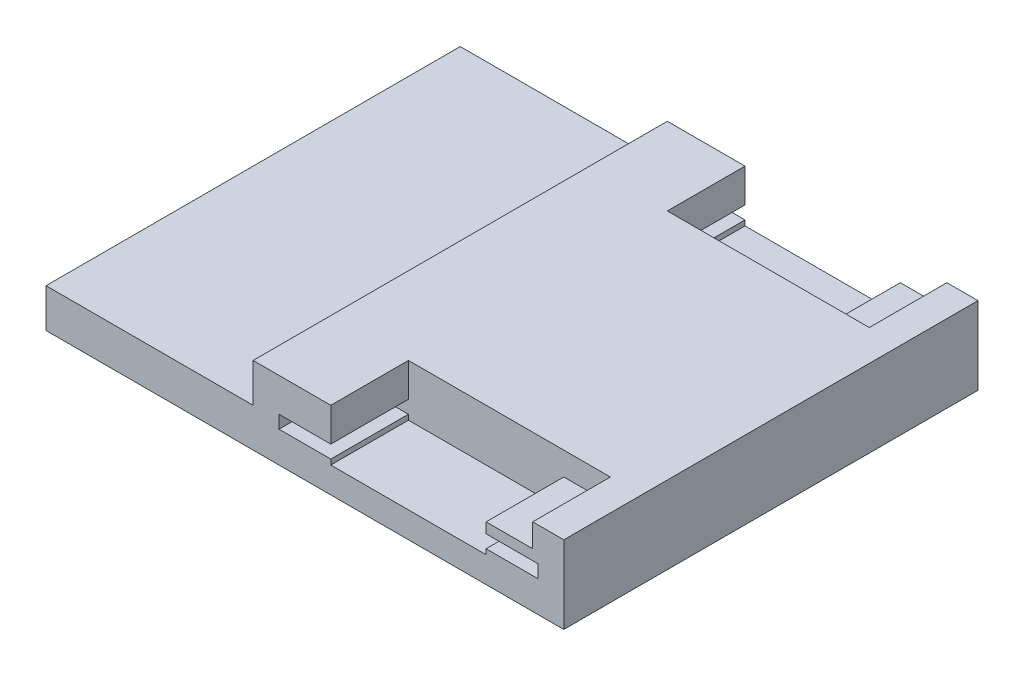
ISO-10303-21;
HEADER;
FILE_DESCRIPTION(('STEP AP214'),'2;1');
FILE_NAME('part.step','',(''),(''),'','','');
FILE_SCHEMA(('AUTOMOTIVE_DESIGN { 1 0 10303 214 1 1 1 1 }'));
ENDSEC;
DATA;
#1=APPLICATION_CONTEXT('core data for automotive mechanical design processes');
#2=APPLICATION_PROTOCOL_DEFINITION('international standard','automotive_design',2000,#1);
#3=PRODUCT_CONTEXT('',#1,'mechanical');
#4=PRODUCT('Part','Part','',(#3));
#5=PRODUCT_RELATED_PRODUCT_CATEGORY('part','',(#4));
#6=PRODUCT_DEFINITION_FORMATION('','',#4);
#7=PRODUCT_DEFINITION_CONTEXT('part definition',#1,'design');
#8=PRODUCT_DEFINITION('design','',#6,#7);
#9=PRODUCT_DEFINITION_SHAPE('','',#8);
#10=(LENGTH_UNIT() NAMED_UNIT(*) SI_UNIT(.MILLI.,.METRE.));
#11=(NAMED_UNIT(*) PLANE_ANGLE_UNIT() SI_UNIT($,.RADIAN.));
#12=(NAMED_UNIT(*) SI_UNIT($,.STERADIAN.) SOLID_ANGLE_UNIT());
#13=UNCERTAINTY_MEASURE_WITH_UNIT(LENGTH_MEASURE(1.E-05),#10,'distance_accuracy_value','');
#14=(GEOMETRIC_REPRESENTATION_CONTEXT(3) GLOBAL_UNCERTAINTY_ASSIGNED_CONTEXT((#13)) GLOBAL_UNIT_ASSIGNED_CONTEXT((#10,
#11,#12)) REPRESENTATION_CONTEXT('',''));
#15=CARTESIAN_POINT('',(0.,0.,0.));
#16=DIRECTION('',(0.,0.,1.));
#17=DIRECTION('',(1.,0.,0.));
#18=AXIS2_PLACEMENT_3D('',#15,#16,#17);
#19=CARTESIAN_POINT('',(0.,20.,0.));
#20=DIRECTION('',(0.,1.,0.));
#21=DIRECTION('',(0.,0.,1.));
#22=AXIS2_PLACEMENT_3D('',#19,#20,#21);
#23=PLANE('',#22);
#24=DIRECTION('',(0.,0.,-1.));
#25=VECTOR('',#24,1.);
#26=CARTESIAN_POINT('',(40.,20.,156.));
#27=LINE('',#26,#25);
#28=CARTESIAN_POINT('',(40.,20.,80.));
#29=VERTEX_POINT('',#28);
#30=CARTESIAN_POINT('',(40.,20.,-80.));
#31=VERTEX_POINT('',#30);
#32=EDGE_CURVE('E269',#29,#31,#27,.T.);
#33=ORIENTED_EDGE('',*,*,#32,.F.);
#34=DIRECTION('',(1.,0.,0.));
#35=VECTOR('',#34,1.);
#36=CARTESIAN_POINT('',(-160.,20.,80.));
#37=LINE('',#36,#35);
#38=CARTESIAN_POINT('',(70.,20.,80.));
#39=VERTEX_POINT('',#38);
#40=EDGE_CURVE('E305',#29,#39,#37,.T.);
#41=ORIENTED_EDGE('',*,*,#40,.T.);
#42=DIRECTION('',(0.,0.,-1.));
#43=VECTOR('',#42,1.);
#44=CARTESIAN_POINT('',(70.,20.,80.));
#45=LINE('',#44,#43);
#46=CARTESIAN_POINT('',(70.,20.,50.));
#47=VERTEX_POINT('',#46);
#48=EDGE_CURVE('E408',#39,#47,#45,.T.);
#49=ORIENTED_EDGE('',*,*,#48,.T.);
#50=DIRECTION('',(1.,0.,0.));
#51=VECTOR('',#50,1.);
#52=CARTESIAN_POINT('',(130.,20.,50.));
#53=LINE('',#52,#51);
#54=CARTESIAN_POINT('',(148.,20.,50.));
#55=VERTEX_POINT('',#54);
#56=EDGE_CURVE('E379',#47,#55,#53,.T.);
#57=ORIENTED_EDGE('',*,*,#56,.T.);
#58=DIRECTION('',(0.,0.,1.));
#59=VECTOR('',#58,1.);
#60=CARTESIAN_POINT('',(148.,20.,50.));
#61=LINE('',#60,#59);
#62=CARTESIAN_POINT('',(148.,20.,80.));
#63=VERTEX_POINT('',#62);
#64=EDGE_CURVE('E447',#55,#63,#61,.T.);
#65=ORIENTED_EDGE('',*,*,#64,.T.);
#66=CARTESIAN_POINT('',(160.,20.,80.));
#67=VERTEX_POINT('',#66);
#68=EDGE_CURVE('E299',#63,#67,#37,.T.);
#69=ORIENTED_EDGE('',*,*,#68,.T.);
#70=DIRECTION('',(0.,0.,-1.));
#71=VECTOR('',#70,1.);
#72=CARTESIAN_POINT('',(160.,20.,-80.));
#73=LINE('',#72,#71);
#74=CARTESIAN_POINT('',(160.,20.,-80.));
#75=VERTEX_POINT('',#74);
#76=EDGE_CURVE('E296',#67,#75,#73,.T.);
#77=ORIENTED_EDGE('',*,*,#76,.T.);
#78=DIRECTION('',(-1.,0.,0.));
#79=VECTOR('',#78,1.);
#80=CARTESIAN_POINT('',(-160.,20.,-80.));
#81=LINE('',#80,#79);
#82=CARTESIAN_POINT('',(148.,20.,-80.));
#83=VERTEX_POINT('',#82);
#84=EDGE_CURVE('E295',#75,#83,#81,.T.);
#85=ORIENTED_EDGE('',*,*,#84,.T.);
#86=DIRECTION('',(0.,0.,-1.));
#87=VECTOR('',#86,1.);
#88=CARTESIAN_POINT('',(148.,20.,-50.));
#89=LINE('',#88,#87);
#90=CARTESIAN_POINT('',(148.,20.,-50.));
#91=VERTEX_POINT('',#90);
#92=EDGE_CURVE('E470',#91,#83,#89,.T.);
#93=ORIENTED_EDGE('',*,*,#92,.F.);
#94=DIRECTION('',(1.,0.,0.));
#95=VECTOR('',#94,1.);
#96=CARTESIAN_POINT('',(130.,20.,-50.));
#97=LINE('',#96,#95);
#98=CARTESIAN_POINT('',(70.,20.,-50.));
#99=VERTEX_POINT('',#98);
#100=EDGE_CURVE('E353',#99,#91,#97,.T.);
#101=ORIENTED_EDGE('',*,*,#100,.F.);
#102=DIRECTION('',(0.,0.,1.));
#103=VECTOR('',#102,1.);
#104=CARTESIAN_POINT('',(70.,20.,-80.));
#105=LINE('',#104,#103);
#106=CARTESIAN_POINT('',(70.,20.,-80.));
#107=VERTEX_POINT('',#106);
#108=EDGE_CURVE('E294',#107,#99,#105,.T.);
#109=ORIENTED_EDGE('',*,*,#108,.F.);
#110=EDGE_CURVE('E287',#107,#31,#81,.T.);
#111=ORIENTED_EDGE('',*,*,#110,.T.);
#112=EDGE_LOOP('',(#33,#41,#49,#57,#65,#69,#77,#85,#93,#101,#109,#111));
#113=FACE_BOUND('',#112,.T.);
#114=ADVANCED_FACE('F47',(#113),#23,.T.);
#115=CARTESIAN_POINT('',(-160.,20.,80.));
#116=DIRECTION('',(0.,0.,-1.));
#117=DIRECTION('',(-1.,0.,0.));
#118=AXIS2_PLACEMENT_3D('',#115,#116,#117);
#119=PLANE('',#118);
#120=DIRECTION('',(-1.,0.,0.));
#121=VECTOR('',#120,1.);
#122=CARTESIAN_POINT('',(-160.,5.,80.));
#123=LINE('',#122,#121);
#124=CARTESIAN_POINT('',(40.,5.,80.));
#125=VERTEX_POINT('',#124);
#126=CARTESIAN_POINT('',(-40.,5.,80.));
#127=VERTEX_POINT('',#126);
#128=EDGE_CURVE('E685',#125,#127,#123,.T.);
#129=ORIENTED_EDGE('',*,*,#128,.T.);
#130=DIRECTION('',(0.,-1.,0.));
#131=VECTOR('',#130,1.);
#132=CARTESIAN_POINT('',(-40.,20.,80.));
#133=LINE('',#132,#131);
#134=CARTESIAN_POINT('',(-40.,-10.,80.));
#135=VERTEX_POINT('',#134);
#136=EDGE_CURVE('E676',#127,#135,#133,.T.);
#137=ORIENTED_EDGE('',*,*,#136,.T.);
#138=DIRECTION('',(-1.,0.,0.));
#139=VECTOR('',#138,1.);
#140=CARTESIAN_POINT('',(-160.,-10.,80.));
#141=LINE('',#140,#139);
#142=CARTESIAN_POINT('',(160.,-10.,80.));
#143=VERTEX_POINT('',#142);
#144=EDGE_CURVE('E458',#143,#135,#141,.T.);
#145=ORIENTED_EDGE('',*,*,#144,.F.);
#146=DIRECTION('',(0.,-1.,0.));
#147=VECTOR('',#146,1.);
#148=CARTESIAN_POINT('',(160.,20.,80.));
#149=LINE('',#148,#147);
#150=EDGE_CURVE('E307',#67,#143,#149,.T.);
#151=ORIENTED_EDGE('',*,*,#150,.F.);
#152=ORIENTED_EDGE('',*,*,#68,.F.);
#153=DIRECTION('',(0.,-1.,0.));
#154=VECTOR('',#153,1.);
#155=CARTESIAN_POINT('',(148.,11.,80.));
#156=LINE('',#155,#154);
#157=CARTESIAN_POINT('',(148.,11.,80.));
#158=VERTEX_POINT('',#157);
#159=EDGE_CURVE('E688',#63,#158,#156,.T.);
#160=ORIENTED_EDGE('',*,*,#159,.T.);
#161=DIRECTION('',(-1.,0.,0.));
#162=VECTOR('',#161,1.);
#163=CARTESIAN_POINT('',(130.,11.,80.));
#164=LINE('',#163,#162);
#165=CARTESIAN_POINT('',(130.,11.,80.));
#166=VERTEX_POINT('',#165);
#167=EDGE_CURVE('E687',#158,#166,#164,.T.);
#168=ORIENTED_EDGE('',*,*,#167,.T.);
#169=DIRECTION('',(0.,1.,0.));
#170=VECTOR('',#169,1.);
#171=CARTESIAN_POINT('',(130.,-8.00000000000001,80.));
#172=LINE('',#171,#170);
#173=CARTESIAN_POINT('',(130.,7.,80.));
#174=VERTEX_POINT('',#173);
#175=EDGE_CURVE('E414',#174,#166,#172,.T.);
#176=ORIENTED_EDGE('',*,*,#175,.F.);
#177=DIRECTION('',(1.,0.,0.));
#178=VECTOR('',#177,1.);
#179=CARTESIAN_POINT('',(130.,7.,80.));
#180=LINE('',#179,#178);
#181=CARTESIAN_POINT('',(150.,7.,80.));
#182=VERTEX_POINT('',#181);
#183=EDGE_CURVE('E362',#174,#182,#180,.T.);
#184=ORIENTED_EDGE('',*,*,#183,.T.);
#185=DIRECTION('',(0.,-1.,0.));
#186=VECTOR('',#185,1.);
#187=CARTESIAN_POINT('',(150.,7.,80.));
#188=LINE('',#187,#186);
#189=CARTESIAN_POINT('',(150.,2.,80.));
#190=VERTEX_POINT('',#189);
#191=EDGE_CURVE('E370',#182,#190,#188,.T.);
#192=ORIENTED_EDGE('',*,*,#191,.T.);
#193=DIRECTION('',(-1.,0.,0.));
#194=VECTOR('',#193,1.);
#195=CARTESIAN_POINT('',(130.,2.,80.));
#196=LINE('',#195,#194);
#197=CARTESIAN_POINT('',(130.,2.,80.));
#198=VERTEX_POINT('',#197);
#199=EDGE_CURVE('E367',#190,#198,#196,.T.);
#200=ORIENTED_EDGE('',*,*,#199,.T.);
#201=CARTESIAN_POINT('',(130.,0.,80.));
#202=VERTEX_POINT('',#201);
#203=EDGE_CURVE('E301',#202,#198,#172,.T.);
#204=ORIENTED_EDGE('',*,*,#203,.F.);
#205=DIRECTION('',(-1.,0.,0.));
#206=VECTOR('',#205,1.);
#207=CARTESIAN_POINT('',(-160.,0.,80.));
#208=LINE('',#207,#206);
#209=CARTESIAN_POINT('',(70.,0.,80.));
#210=VERTEX_POINT('',#209);
#211=EDGE_CURVE('E455',#202,#210,#208,.T.);
#212=ORIENTED_EDGE('',*,*,#211,.T.);
#213=DIRECTION('',(0.,1.,0.));
#214=VECTOR('',#213,1.);
#215=CARTESIAN_POINT('',(70.,-8.00000000000001,80.));
#216=LINE('',#215,#214);
#217=CARTESIAN_POINT('',(70.,2.,80.));
#218=VERTEX_POINT('',#217);
#219=EDGE_CURVE('E415',#210,#218,#216,.T.);
#220=ORIENTED_EDGE('',*,*,#219,.T.);
#221=DIRECTION('',(-1.,0.,0.));
#222=VECTOR('',#221,1.);
#223=CARTESIAN_POINT('',(70.,2.,80.));
#224=LINE('',#223,#222);
#225=CARTESIAN_POINT('',(50.,2.,80.));
#226=VERTEX_POINT('',#225);
#227=EDGE_CURVE('E388',#218,#226,#224,.T.);
#228=ORIENTED_EDGE('',*,*,#227,.T.);
#229=DIRECTION('',(0.,1.,0.));
#230=VECTOR('',#229,1.);
#231=CARTESIAN_POINT('',(50.,7.,80.));
#232=LINE('',#231,#230);
#233=CARTESIAN_POINT('',(50.,7.,80.));
#234=VERTEX_POINT('',#233);
#235=EDGE_CURVE('E395',#226,#234,#232,.T.);
#236=ORIENTED_EDGE('',*,*,#235,.T.);
#237=DIRECTION('',(1.,0.,0.));
#238=VECTOR('',#237,1.);
#239=CARTESIAN_POINT('',(70.,7.,80.));
#240=LINE('',#239,#238);
#241=CARTESIAN_POINT('',(70.,7.,80.));
#242=VERTEX_POINT('',#241);
#243=EDGE_CURVE('E358',#234,#242,#240,.T.);
#244=ORIENTED_EDGE('',*,*,#243,.T.);
#245=EDGE_CURVE('E418',#242,#39,#216,.T.);
#246=ORIENTED_EDGE('',*,*,#245,.T.);
#247=ORIENTED_EDGE('',*,*,#40,.F.);
#248=DIRECTION('',(0.,-1.,0.));
#249=VECTOR('',#248,1.);
#250=CARTESIAN_POINT('',(40.,20.0000000000001,80.));
#251=LINE('',#250,#249);
#252=EDGE_CURVE('E276',#29,#125,#251,.T.);
#253=ORIENTED_EDGE('',*,*,#252,.T.);
#254=EDGE_LOOP('',(#129,#137,#145,#151,#152,#160,#168,#176,#184,#192,#200,#204,#212,#220,#228,
#236,#244,#246,#247,#253));
#255=FACE_BOUND('',#254,.T.);
#256=ADVANCED_FACE('F585',(#255),#119,.F.);
#257=CARTESIAN_POINT('',(130.,-8.00000000000001,80.));
#258=DIRECTION('',(-1.,0.,0.));
#259=DIRECTION('',(0.,0.,1.));
#260=AXIS2_PLACEMENT_3D('',#257,#258,#259);
#261=PLANE('',#260);
#262=ORIENTED_EDGE('',*,*,#175,.T.);
#263=DIRECTION('',(0.,0.,1.));
#264=VECTOR('',#263,1.);
#265=CARTESIAN_POINT('',(130.,11.,50.));
#266=LINE('',#265,#264);
#267=CARTESIAN_POINT('',(130.,11.,50.));
#268=VERTEX_POINT('',#267);
#269=EDGE_CURVE('E440',#268,#166,#266,.T.);
#270=ORIENTED_EDGE('',*,*,#269,.F.);
#271=DIRECTION('',(0.,1.,0.));
#272=VECTOR('',#271,1.);
#273=CARTESIAN_POINT('',(130.,-8.00000000000001,50.));
#274=LINE('',#273,#272);
#275=CARTESIAN_POINT('',(130.,7.,50.));
#276=VERTEX_POINT('',#275);
#277=EDGE_CURVE('E411',#276,#268,#274,.T.);
#278=ORIENTED_EDGE('',*,*,#277,.F.);
#279=DIRECTION('',(0.,0.,1.));
#280=VECTOR('',#279,1.);
#281=CARTESIAN_POINT('',(130.,7.,50.));
#282=LINE('',#281,#280);
#283=EDGE_CURVE('E376',#276,#174,#282,.T.);
#284=ORIENTED_EDGE('',*,*,#283,.T.);
#285=EDGE_LOOP('',(#262,#270,#278,#284));
#286=FACE_BOUND('',#285,.T.);
#287=ADVANCED_FACE('F438',(#286),#261,.T.);
#288=CARTESIAN_POINT('',(130.,-8.00000000000001,-80.));
#289=DIRECTION('',(1.,0.,0.));
#290=DIRECTION('',(0.,0.,-1.));
#291=AXIS2_PLACEMENT_3D('',#288,#289,#290);
#292=PLANE('',#291);
#293=DIRECTION('',(0.,1.,0.));
#294=VECTOR('',#293,1.);
#295=CARTESIAN_POINT('',(130.,-8.00000000000001,-50.));
#296=LINE('',#295,#294);
#297=CARTESIAN_POINT('',(130.,0.,-50.));
#298=VERTEX_POINT('',#297);
#299=CARTESIAN_POINT('',(130.,2.,-50.));
#300=VERTEX_POINT('',#299);
#301=EDGE_CURVE('E342',#298,#300,#296,.T.);
#302=ORIENTED_EDGE('',*,*,#301,.T.);
#303=DIRECTION('',(0.,0.,-1.));
#304=VECTOR('',#303,1.);
#305=CARTESIAN_POINT('',(130.,2.,-50.));
#306=LINE('',#305,#304);
#307=CARTESIAN_POINT('',(130.,2.,-80.));
#308=VERTEX_POINT('',#307);
#309=EDGE_CURVE('E499',#300,#308,#306,.T.);
#310=ORIENTED_EDGE('',*,*,#309,.T.);
#311=DIRECTION('',(0.,1.,0.));
#312=VECTOR('',#311,1.);
#313=CARTESIAN_POINT('',(130.,20.,-80.));
#314=LINE('',#313,#312);
#315=CARTESIAN_POINT('',(130.,0.,-80.));
#316=VERTEX_POINT('',#315);
#317=EDGE_CURVE('E323',#316,#308,#314,.T.);
#318=ORIENTED_EDGE('',*,*,#317,.F.);
#319=DIRECTION('',(0.,0.,-1.));
#320=VECTOR('',#319,1.);
#321=CARTESIAN_POINT('',(130.,0.,0.));
#322=LINE('',#321,#320);
#323=EDGE_CURVE('E331',#298,#316,#322,.T.);
#324=ORIENTED_EDGE('',*,*,#323,.F.);
#325=EDGE_LOOP('',(#302,#310,#318,#324));
#326=FACE_BOUND('',#325,.T.);
#327=ADVANCED_FACE('F558',(#326),#292,.F.);
#328=CARTESIAN_POINT('',(70.,-8.00000000000001,-80.));
#329=DIRECTION('',(-1.,0.,0.));
#330=DIRECTION('',(0.,0.,1.));
#331=AXIS2_PLACEMENT_3D('',#328,#329,#330);
#332=PLANE('',#331);
#333=DIRECTION('',(0.,1.,0.));
#334=VECTOR('',#333,1.);
#335=CARTESIAN_POINT('',(70.,-8.00000000000001,-50.));
#336=LINE('',#335,#334);
#337=CARTESIAN_POINT('',(70.,7.,-50.));
#338=VERTEX_POINT('',#337);
#339=EDGE_CURVE('E349',#338,#99,#336,.T.);
#340=ORIENTED_EDGE('',*,*,#339,.F.);
#341=DIRECTION('',(0.,0.,-1.));
#342=VECTOR('',#341,1.);
#343=CARTESIAN_POINT('',(70.,7.,-50.));
#344=LINE('',#343,#342);
#345=CARTESIAN_POINT('',(70.,7.,-80.));
#346=VERTEX_POINT('',#345);
#347=EDGE_CURVE('E495',#338,#346,#344,.T.);
#348=ORIENTED_EDGE('',*,*,#347,.T.);
#349=DIRECTION('',(0.,-1.,0.));
#350=VECTOR('',#349,1.);
#351=CARTESIAN_POINT('',(70.,20.,-80.));
#352=LINE('',#351,#350);
#353=EDGE_CURVE('E320',#107,#346,#352,.T.);
#354=ORIENTED_EDGE('',*,*,#353,.F.);
#355=ORIENTED_EDGE('',*,*,#108,.T.);
#356=EDGE_LOOP('',(#340,#348,#354,#355));
#357=FACE_BOUND('',#356,.T.);
#358=ADVANCED_FACE('F571',(#357),#332,.F.);
#359=CARTESIAN_POINT('',(-160.,20.,-80.));
#360=DIRECTION('',(0.,0.,1.));
#361=DIRECTION('',(1.,0.,0.));
#362=AXIS2_PLACEMENT_3D('',#359,#360,#361);
#363=PLANE('',#362);
#364=DIRECTION('',(1.,0.,0.));
#365=VECTOR('',#364,1.);
#366=CARTESIAN_POINT('',(-160.,-10.,-80.));
#367=LINE('',#366,#365);
#368=CARTESIAN_POINT('',(-40.,-10.,-80.));
#369=VERTEX_POINT('',#368);
#370=CARTESIAN_POINT('',(160.,-10.,-80.));
#371=VERTEX_POINT('',#370);
#372=EDGE_CURVE('E452',#369,#371,#367,.T.);
#373=ORIENTED_EDGE('',*,*,#372,.F.);
#374=DIRECTION('',(0.,-1.,0.));
#375=VECTOR('',#374,1.);
#376=CARTESIAN_POINT('',(-40.,5.,-80.));
#377=LINE('',#376,#375);
#378=CARTESIAN_POINT('',(-40.,5.,-80.));
#379=VERTEX_POINT('',#378);
#380=EDGE_CURVE('E61',#379,#369,#377,.T.);
#381=ORIENTED_EDGE('',*,*,#380,.F.);
#382=DIRECTION('',(-1.,0.,0.));
#383=VECTOR('',#382,1.);
#384=CARTESIAN_POINT('',(40.,5.,-80.));
#385=LINE('',#384,#383);
#386=CARTESIAN_POINT('',(40.,5.,-80.));
#387=VERTEX_POINT('',#386);
#388=EDGE_CURVE('E289',#387,#379,#385,.T.);
#389=ORIENTED_EDGE('',*,*,#388,.F.);
#390=DIRECTION('',(0.,-1.,0.));
#391=VECTOR('',#390,1.);
#392=CARTESIAN_POINT('',(40.,20.,-80.));
#393=LINE('',#392,#391);
#394=EDGE_CURVE('E273',#31,#387,#393,.T.);
#395=ORIENTED_EDGE('',*,*,#394,.F.);
#396=ORIENTED_EDGE('',*,*,#110,.F.);
#397=ORIENTED_EDGE('',*,*,#353,.T.);
#398=DIRECTION('',(1.,0.,0.));
#399=VECTOR('',#398,1.);
#400=CARTESIAN_POINT('',(70.,7.,-80.));
#401=LINE('',#400,#399);
#402=CARTESIAN_POINT('',(50.,7.,-80.));
#403=VERTEX_POINT('',#402);
#404=EDGE_CURVE('E510',#403,#346,#401,.T.);
#405=ORIENTED_EDGE('',*,*,#404,.F.);
#406=DIRECTION('',(0.,1.,0.));
#407=VECTOR('',#406,1.);
#408=CARTESIAN_POINT('',(50.,7.,-80.));
#409=LINE('',#408,#407);
#410=CARTESIAN_POINT('',(50.,2.,-80.));
#411=VERTEX_POINT('',#410);
#412=EDGE_CURVE('E517',#411,#403,#409,.T.);
#413=ORIENTED_EDGE('',*,*,#412,.F.);
#414=DIRECTION('',(-1.,0.,0.));
#415=VECTOR('',#414,1.);
#416=CARTESIAN_POINT('',(70.,2.,-80.));
#417=LINE('',#416,#415);
#418=CARTESIAN_POINT('',(70.,2.,-80.));
#419=VERTEX_POINT('',#418);
#420=EDGE_CURVE('E477',#419,#411,#417,.T.);
#421=ORIENTED_EDGE('',*,*,#420,.F.);
#422=CARTESIAN_POINT('',(70.,0.,-80.));
#423=VERTEX_POINT('',#422);
#424=EDGE_CURVE('E319',#419,#423,#352,.T.);
#425=ORIENTED_EDGE('',*,*,#424,.T.);
#426=DIRECTION('',(1.,0.,0.));
#427=VECTOR('',#426,1.);
#428=CARTESIAN_POINT('',(-160.,0.,-80.));
#429=LINE('',#428,#427);
#430=EDGE_CURVE('E462',#423,#316,#429,.T.);
#431=ORIENTED_EDGE('',*,*,#430,.T.);
#432=ORIENTED_EDGE('',*,*,#317,.T.);
#433=DIRECTION('',(-1.,0.,0.));
#434=VECTOR('',#433,1.);
#435=CARTESIAN_POINT('',(130.,2.,-80.));
#436=LINE('',#435,#434);
#437=CARTESIAN_POINT('',(150.,2.,-80.));
#438=VERTEX_POINT('',#437);
#439=EDGE_CURVE('E485',#438,#308,#436,.T.);
#440=ORIENTED_EDGE('',*,*,#439,.F.);
#441=DIRECTION('',(0.,-1.,0.));
#442=VECTOR('',#441,1.);
#443=CARTESIAN_POINT('',(150.,7.,-80.));
#444=LINE('',#443,#442);
#445=CARTESIAN_POINT('',(150.,7.,-80.));
#446=VERTEX_POINT('',#445);
#447=EDGE_CURVE('E494',#446,#438,#444,.T.);
#448=ORIENTED_EDGE('',*,*,#447,.F.);
#449=DIRECTION('',(1.,0.,0.));
#450=VECTOR('',#449,1.);
#451=CARTESIAN_POINT('',(130.,7.,-80.));
#452=LINE('',#451,#450);
#453=CARTESIAN_POINT('',(130.,7.,-80.));
#454=VERTEX_POINT('',#453);
#455=EDGE_CURVE('E491',#454,#446,#452,.T.);
#456=ORIENTED_EDGE('',*,*,#455,.F.);
#457=CARTESIAN_POINT('',(130.,11.,-80.));
#458=VERTEX_POINT('',#457);
#459=EDGE_CURVE('E322',#454,#458,#314,.T.);
#460=ORIENTED_EDGE('',*,*,#459,.T.);
#461=DIRECTION('',(-1.,0.,0.));
#462=VECTOR('',#461,1.);
#463=CARTESIAN_POINT('',(130.,11.,-80.));
#464=LINE('',#463,#462);
#465=CARTESIAN_POINT('',(148.,11.,-80.));
#466=VERTEX_POINT('',#465);
#467=EDGE_CURVE('E468',#466,#458,#464,.T.);
#468=ORIENTED_EDGE('',*,*,#467,.F.);
#469=DIRECTION('',(0.,-1.,0.));
#470=VECTOR('',#469,1.);
#471=CARTESIAN_POINT('',(148.,11.,-80.));
#472=LINE('',#471,#470);
#473=EDGE_CURVE('E461',#83,#466,#472,.T.);
#474=ORIENTED_EDGE('',*,*,#473,.F.);
#475=ORIENTED_EDGE('',*,*,#84,.F.);
#476=DIRECTION('',(0.,-1.,0.));
#477=VECTOR('',#476,1.);
#478=CARTESIAN_POINT('',(160.,20.,-80.));
#479=LINE('',#478,#477);
#480=EDGE_CURVE('E309',#75,#371,#479,.T.);
#481=ORIENTED_EDGE('',*,*,#480,.T.);
#482=EDGE_LOOP('',(#373,#381,#389,#395,#396,#397,#405,#413,#421,#425,#431,#432,#440,#448,#456,
#460,#468,#474,#475,#481));
#483=FACE_BOUND('',#482,.T.);
#484=ADVANCED_FACE('F285',(#483),#363,.F.);
#485=ORIENTED_EDGE('',*,*,#203,.T.);
#486=DIRECTION('',(0.,0.,1.));
#487=VECTOR('',#486,1.);
#488=CARTESIAN_POINT('',(130.,2.,50.));
#489=LINE('',#488,#487);
#490=CARTESIAN_POINT('',(130.,2.,50.));
#491=VERTEX_POINT('',#490);
#492=EDGE_CURVE('E366',#491,#198,#489,.T.);
#493=ORIENTED_EDGE('',*,*,#492,.F.);
#494=CARTESIAN_POINT('',(130.,0.,50.));
#495=VERTEX_POINT('',#494);
#496=EDGE_CURVE('E422',#495,#491,#274,.T.);
#497=ORIENTED_EDGE('',*,*,#496,.F.);
#498=DIRECTION('',(0.,0.,1.));
#499=VECTOR('',#498,1.);
#500=CARTESIAN_POINT('',(130.,0.,0.));
#501=LINE('',#500,#499);
#502=EDGE_CURVE('E317',#495,#202,#501,.T.);
#503=ORIENTED_EDGE('',*,*,#502,.T.);
#504=EDGE_LOOP('',(#485,#493,#497,#503));
#505=FACE_BOUND('',#504,.T.);
#506=ADVANCED_FACE('F579',(#505),#261,.T.);
#507=CARTESIAN_POINT('',(70.,-8.00000000000001,80.));
#508=DIRECTION('',(1.,0.,0.));
#509=DIRECTION('',(0.,0.,-1.));
#510=AXIS2_PLACEMENT_3D('',#507,#508,#509);
#511=PLANE('',#510);
#512=DIRECTION('',(0.,1.,0.));
#513=VECTOR('',#512,1.);
#514=CARTESIAN_POINT('',(70.,-8.00000000000001,50.));
#515=LINE('',#514,#513);
#516=CARTESIAN_POINT('',(70.,0.,50.));
#517=VERTEX_POINT('',#516);
#518=CARTESIAN_POINT('',(70.,2.,50.));
#519=VERTEX_POINT('',#518);
#520=EDGE_CURVE('E419',#517,#519,#515,.T.);
#521=ORIENTED_EDGE('',*,*,#520,.T.);
#522=DIRECTION('',(0.,0.,1.));
#523=VECTOR('',#522,1.);
#524=CARTESIAN_POINT('',(70.,2.,50.));
#525=LINE('',#524,#523);
#526=EDGE_CURVE('E371',#519,#218,#525,.T.);
#527=ORIENTED_EDGE('',*,*,#526,.T.);
#528=ORIENTED_EDGE('',*,*,#219,.F.);
#529=DIRECTION('',(0.,0.,-1.));
#530=VECTOR('',#529,1.);
#531=CARTESIAN_POINT('',(70.,0.,0.));
#532=LINE('',#531,#530);
#533=EDGE_CURVE('E314',#210,#517,#532,.T.);
#534=ORIENTED_EDGE('',*,*,#533,.T.);
#535=EDGE_LOOP('',(#521,#527,#528,#534));
#536=FACE_BOUND('',#535,.T.);
#537=ADVANCED_FACE('F599',(#536),#511,.T.);
#538=ORIENTED_EDGE('',*,*,#245,.F.);
#539=DIRECTION('',(0.,0.,1.));
#540=VECTOR('',#539,1.);
#541=CARTESIAN_POINT('',(70.,7.,50.));
#542=LINE('',#541,#540);
#543=CARTESIAN_POINT('',(70.,7.,50.));
#544=VERTEX_POINT('',#543);
#545=EDGE_CURVE('E392',#544,#242,#542,.T.);
#546=ORIENTED_EDGE('',*,*,#545,.F.);
#547=EDGE_CURVE('E421',#544,#47,#515,.T.);
#548=ORIENTED_EDGE('',*,*,#547,.T.);
#549=ORIENTED_EDGE('',*,*,#48,.F.);
#550=EDGE_LOOP('',(#538,#546,#548,#549));
#551=FACE_BOUND('',#550,.T.);
#552=ADVANCED_FACE('F602',(#551),#511,.T.);
#553=CARTESIAN_POINT('',(160.,20.,-80.));
#554=DIRECTION('',(-1.,0.,0.));
#555=DIRECTION('',(0.,0.,1.));
#556=AXIS2_PLACEMENT_3D('',#553,#554,#555);
#557=PLANE('',#556);
#558=ORIENTED_EDGE('',*,*,#150,.T.);
#559=DIRECTION('',(0.,0.,1.));
#560=VECTOR('',#559,1.);
#561=CARTESIAN_POINT('',(160.,-10.,80.));
#562=LINE('',#561,#560);
#563=EDGE_CURVE('E454',#371,#143,#562,.T.);
#564=ORIENTED_EDGE('',*,*,#563,.F.);
#565=ORIENTED_EDGE('',*,*,#480,.F.);
#566=ORIENTED_EDGE('',*,*,#76,.F.);
#567=EDGE_LOOP('',(#558,#564,#565,#566));
#568=FACE_BOUND('',#567,.T.);
#569=ADVANCED_FACE('F49',(#568),#557,.F.);
#570=CARTESIAN_POINT('',(130.,-8.00000000000001,50.));
#571=DIRECTION('',(0.,0.,1.));
#572=DIRECTION('',(1.,0.,0.));
#573=AXIS2_PLACEMENT_3D('',#570,#571,#572);
#574=PLANE('',#573);
#575=DIRECTION('',(1.,0.,0.));
#576=VECTOR('',#575,1.);
#577=CARTESIAN_POINT('',(0.,0.,50.));
#578=LINE('',#577,#576);
#579=EDGE_CURVE('E312',#517,#495,#578,.T.);
#580=ORIENTED_EDGE('',*,*,#579,.T.);
#581=ORIENTED_EDGE('',*,*,#496,.T.);
#582=DIRECTION('',(-1.,0.,0.));
#583=VECTOR('',#582,1.);
#584=CARTESIAN_POINT('',(130.,2.,50.));
#585=LINE('',#584,#583);
#586=CARTESIAN_POINT('',(150.,2.,50.));
#587=VERTEX_POINT('',#586);
#588=EDGE_CURVE('E359',#587,#491,#585,.T.);
#589=ORIENTED_EDGE('',*,*,#588,.F.);
#590=DIRECTION('',(0.,-1.,0.));
#591=VECTOR('',#590,1.);
#592=CARTESIAN_POINT('',(150.,7.,50.));
#593=LINE('',#592,#591);
#594=CARTESIAN_POINT('',(150.,7.,50.));
#595=VERTEX_POINT('',#594);
#596=EDGE_CURVE('E361',#595,#587,#593,.T.);
#597=ORIENTED_EDGE('',*,*,#596,.F.);
#598=DIRECTION('',(1.,0.,0.));
#599=VECTOR('',#598,1.);
#600=CARTESIAN_POINT('',(130.,7.,50.));
#601=LINE('',#600,#599);
#602=EDGE_CURVE('E364',#276,#595,#601,.T.);
#603=ORIENTED_EDGE('',*,*,#602,.F.);
#604=ORIENTED_EDGE('',*,*,#277,.T.);
#605=DIRECTION('',(-1.,0.,0.));
#606=VECTOR('',#605,1.);
#607=CARTESIAN_POINT('',(130.,11.,50.));
#608=LINE('',#607,#606);
#609=CARTESIAN_POINT('',(148.,11.,50.));
#610=VERTEX_POINT('',#609);
#611=EDGE_CURVE('E433',#610,#268,#608,.T.);
#612=ORIENTED_EDGE('',*,*,#611,.F.);
#613=DIRECTION('',(0.,-1.,0.));
#614=VECTOR('',#613,1.);
#615=CARTESIAN_POINT('',(148.,11.,50.));
#616=LINE('',#615,#614);
#617=EDGE_CURVE('E445',#55,#610,#616,.T.);
#618=ORIENTED_EDGE('',*,*,#617,.F.);
#619=ORIENTED_EDGE('',*,*,#56,.F.);
#620=ORIENTED_EDGE('',*,*,#547,.F.);
#621=DIRECTION('',(1.,0.,0.));
#622=VECTOR('',#621,1.);
#623=CARTESIAN_POINT('',(70.,7.,50.));
#624=LINE('',#623,#622);
#625=CARTESIAN_POINT('',(50.,7.,50.));
#626=VERTEX_POINT('',#625);
#627=EDGE_CURVE('E385',#626,#544,#624,.T.);
#628=ORIENTED_EDGE('',*,*,#627,.F.);
#629=DIRECTION('',(0.,1.,0.));
#630=VECTOR('',#629,1.);
#631=CARTESIAN_POINT('',(50.,7.,50.));
#632=LINE('',#631,#630);
#633=CARTESIAN_POINT('',(50.,2.,50.));
#634=VERTEX_POINT('',#633);
#635=EDGE_CURVE('E387',#634,#626,#632,.T.);
#636=ORIENTED_EDGE('',*,*,#635,.F.);
#637=DIRECTION('',(-1.,0.,0.));
#638=VECTOR('',#637,1.);
#639=CARTESIAN_POINT('',(70.,2.,50.));
#640=LINE('',#639,#638);
#641=EDGE_CURVE('E390',#519,#634,#640,.T.);
#642=ORIENTED_EDGE('',*,*,#641,.F.);
#643=ORIENTED_EDGE('',*,*,#520,.F.);
#644=EDGE_LOOP('',(#580,#581,#589,#597,#603,#604,#612,#618,#619,#620,#628,#636,#642,#643));
#645=FACE_BOUND('',#644,.T.);
#646=ADVANCED_FACE('F431',(#645),#574,.T.);
#647=CARTESIAN_POINT('',(70.,2.,50.));
#648=DIRECTION('',(0.,1.,0.));
#649=DIRECTION('',(0.,0.,1.));
#650=AXIS2_PLACEMENT_3D('',#647,#648,#649);
#651=PLANE('',#650);
#652=ORIENTED_EDGE('',*,*,#227,.F.);
#653=ORIENTED_EDGE('',*,*,#526,.F.);
#654=ORIENTED_EDGE('',*,*,#641,.T.);
#655=DIRECTION('',(0.,0.,1.));
#656=VECTOR('',#655,1.);
#657=CARTESIAN_POINT('',(50.,2.,50.));
#658=LINE('',#657,#656);
#659=EDGE_CURVE('E402',#634,#226,#658,.T.);
#660=ORIENTED_EDGE('',*,*,#659,.T.);
#661=EDGE_LOOP('',(#652,#653,#654,#660));
#662=FACE_BOUND('',#661,.T.);
#663=ADVANCED_FACE('F598',(#662),#651,.T.);
#664=CARTESIAN_POINT('',(50.,7.,50.));
#665=DIRECTION('',(1.,0.,0.));
#666=DIRECTION('',(0.,0.,-1.));
#667=AXIS2_PLACEMENT_3D('',#664,#665,#666);
#668=PLANE('',#667);
#669=ORIENTED_EDGE('',*,*,#235,.F.);
#670=ORIENTED_EDGE('',*,*,#659,.F.);
#671=ORIENTED_EDGE('',*,*,#635,.T.);
#672=DIRECTION('',(0.,0.,1.));
#673=VECTOR('',#672,1.);
#674=CARTESIAN_POINT('',(50.,7.,50.));
#675=LINE('',#674,#673);
#676=EDGE_CURVE('E404',#626,#234,#675,.T.);
#677=ORIENTED_EDGE('',*,*,#676,.T.);
#678=EDGE_LOOP('',(#669,#670,#671,#677));
#679=FACE_BOUND('',#678,.T.);
#680=ADVANCED_FACE('F608',(#679),#668,.T.);
#681=CARTESIAN_POINT('',(70.,7.,50.));
#682=DIRECTION('',(0.,-1.,0.));
#683=DIRECTION('',(0.,0.,-1.));
#684=AXIS2_PLACEMENT_3D('',#681,#682,#683);
#685=PLANE('',#684);
#686=ORIENTED_EDGE('',*,*,#243,.F.);
#687=ORIENTED_EDGE('',*,*,#676,.F.);
#688=ORIENTED_EDGE('',*,*,#627,.T.);
#689=ORIENTED_EDGE('',*,*,#545,.T.);
#690=EDGE_LOOP('',(#686,#687,#688,#689));
#691=FACE_BOUND('',#690,.T.);
#692=ADVANCED_FACE('F604',(#691),#685,.T.);
#693=CARTESIAN_POINT('',(130.,7.,50.));
#694=DIRECTION('',(0.,-1.,0.));
#695=DIRECTION('',(1.,0.,0.));
#696=AXIS2_PLACEMENT_3D('',#693,#694,#695);
#697=PLANE('',#696);
#698=ORIENTED_EDGE('',*,*,#183,.F.);
#699=ORIENTED_EDGE('',*,*,#283,.F.);
#700=ORIENTED_EDGE('',*,*,#602,.T.);
#701=DIRECTION('',(0.,0.,1.));
#702=VECTOR('',#701,1.);
#703=CARTESIAN_POINT('',(150.,7.,50.));
#704=LINE('',#703,#702);
#705=EDGE_CURVE('E380',#595,#182,#704,.T.);
#706=ORIENTED_EDGE('',*,*,#705,.T.);
#707=EDGE_LOOP('',(#698,#699,#700,#706));
#708=FACE_BOUND('',#707,.T.);
#709=ADVANCED_FACE('F607',(#708),#697,.T.);
#710=CARTESIAN_POINT('',(150.,7.,50.));
#711=DIRECTION('',(-1.,0.,0.));
#712=DIRECTION('',(0.,0.,1.));
#713=AXIS2_PLACEMENT_3D('',#710,#711,#712);
#714=PLANE('',#713);
#715=ORIENTED_EDGE('',*,*,#191,.F.);
#716=ORIENTED_EDGE('',*,*,#705,.F.);
#717=ORIENTED_EDGE('',*,*,#596,.T.);
#718=DIRECTION('',(0.,0.,1.));
#719=VECTOR('',#718,1.);
#720=CARTESIAN_POINT('',(150.,2.,50.));
#721=LINE('',#720,#719);
#722=EDGE_CURVE('E382',#587,#190,#721,.T.);
#723=ORIENTED_EDGE('',*,*,#722,.T.);
#724=EDGE_LOOP('',(#715,#716,#717,#723));
#725=FACE_BOUND('',#724,.T.);
#726=ADVANCED_FACE('F618',(#725),#714,.T.);
#727=CARTESIAN_POINT('',(130.,2.,50.));
#728=DIRECTION('',(0.,1.,0.));
#729=DIRECTION('',(-1.,0.,0.));
#730=AXIS2_PLACEMENT_3D('',#727,#728,#729);
#731=PLANE('',#730);
#732=ORIENTED_EDGE('',*,*,#199,.F.);
#733=ORIENTED_EDGE('',*,*,#722,.F.);
#734=ORIENTED_EDGE('',*,*,#588,.T.);
#735=ORIENTED_EDGE('',*,*,#492,.T.);
#736=EDGE_LOOP('',(#732,#733,#734,#735));
#737=FACE_BOUND('',#736,.T.);
#738=ADVANCED_FACE('F616',(#737),#731,.T.);
#739=CARTESIAN_POINT('',(130.,-8.00000000000001,-50.));
#740=DIRECTION('',(0.,0.,1.));
#741=DIRECTION('',(1.,0.,0.));
#742=AXIS2_PLACEMENT_3D('',#739,#740,#741);
#743=PLANE('',#742);
#744=CARTESIAN_POINT('',(70.,0.,-50.));
#745=VERTEX_POINT('',#744);
#746=CARTESIAN_POINT('',(70.,2.,-50.));
#747=VERTEX_POINT('',#746);
#748=EDGE_CURVE('E340',#745,#747,#336,.T.);
#749=ORIENTED_EDGE('',*,*,#748,.T.);
#750=DIRECTION('',(-1.,0.,0.));
#751=VECTOR('',#750,1.);
#752=CARTESIAN_POINT('',(70.,2.,-50.));
#753=LINE('',#752,#751);
#754=CARTESIAN_POINT('',(50.,2.,-50.));
#755=VERTEX_POINT('',#754);
#756=EDGE_CURVE('E507',#747,#755,#753,.T.);
#757=ORIENTED_EDGE('',*,*,#756,.T.);
#758=DIRECTION('',(0.,1.,0.));
#759=VECTOR('',#758,1.);
#760=CARTESIAN_POINT('',(50.,7.,-50.));
#761=LINE('',#760,#759);
#762=CARTESIAN_POINT('',(50.,7.,-50.));
#763=VERTEX_POINT('',#762);
#764=EDGE_CURVE('E509',#755,#763,#761,.T.);
#765=ORIENTED_EDGE('',*,*,#764,.T.);
#766=DIRECTION('',(1.,0.,0.));
#767=VECTOR('',#766,1.);
#768=CARTESIAN_POINT('',(70.,7.,-50.));
#769=LINE('',#768,#767);
#770=EDGE_CURVE('E513',#763,#338,#769,.T.);
#771=ORIENTED_EDGE('',*,*,#770,.T.);
#772=ORIENTED_EDGE('',*,*,#339,.T.);
#773=ORIENTED_EDGE('',*,*,#100,.T.);
#774=DIRECTION('',(0.,-1.,0.));
#775=VECTOR('',#774,1.);
#776=CARTESIAN_POINT('',(148.,11.,-50.));
#777=LINE('',#776,#775);
#778=CARTESIAN_POINT('',(148.,11.,-50.));
#779=VERTEX_POINT('',#778);
#780=EDGE_CURVE('E466',#91,#779,#777,.T.);
#781=ORIENTED_EDGE('',*,*,#780,.T.);
#782=DIRECTION('',(-1.,0.,0.));
#783=VECTOR('',#782,1.);
#784=CARTESIAN_POINT('',(130.,11.,-50.));
#785=LINE('',#784,#783);
#786=CARTESIAN_POINT('',(130.,11.,-50.));
#787=VERTEX_POINT('',#786);
#788=EDGE_CURVE('E69',#779,#787,#785,.T.);
#789=ORIENTED_EDGE('',*,*,#788,.T.);
#790=CARTESIAN_POINT('',(130.,7.,-50.));
#791=VERTEX_POINT('',#790);
#792=EDGE_CURVE('E348',#791,#787,#296,.T.);
#793=ORIENTED_EDGE('',*,*,#792,.F.);
#794=DIRECTION('',(1.,0.,0.));
#795=VECTOR('',#794,1.);
#796=CARTESIAN_POINT('',(130.,7.,-50.));
#797=LINE('',#796,#795);
#798=CARTESIAN_POINT('',(150.,7.,-50.));
#799=VERTEX_POINT('',#798);
#800=EDGE_CURVE('E481',#791,#799,#797,.T.);
#801=ORIENTED_EDGE('',*,*,#800,.T.);
#802=DIRECTION('',(0.,-1.,0.));
#803=VECTOR('',#802,1.);
#804=CARTESIAN_POINT('',(150.,7.,-50.));
#805=LINE('',#804,#803);
#806=CARTESIAN_POINT('',(150.,2.,-50.));
#807=VERTEX_POINT('',#806);
#808=EDGE_CURVE('E484',#799,#807,#805,.T.);
#809=ORIENTED_EDGE('',*,*,#808,.T.);
#810=DIRECTION('',(-1.,0.,0.));
#811=VECTOR('',#810,1.);
#812=CARTESIAN_POINT('',(130.,2.,-50.));
#813=LINE('',#812,#811);
#814=EDGE_CURVE('E488',#807,#300,#813,.T.);
#815=ORIENTED_EDGE('',*,*,#814,.T.);
#816=ORIENTED_EDGE('',*,*,#301,.F.);
#817=DIRECTION('',(1.,0.,0.));
#818=VECTOR('',#817,1.);
#819=CARTESIAN_POINT('',(0.,0.,-50.));
#820=LINE('',#819,#818);
#821=EDGE_CURVE('E55',#745,#298,#820,.T.);
#822=ORIENTED_EDGE('',*,*,#821,.F.);
#823=EDGE_LOOP('',(#749,#757,#765,#771,#772,#773,#781,#789,#793,#801,#809,#815,#816,#822));
#824=FACE_BOUND('',#823,.T.);
#825=ADVANCED_FACE('F338',(#824),#743,.F.);
#826=ORIENTED_EDGE('',*,*,#792,.T.);
#827=DIRECTION('',(0.,0.,-1.));
#828=VECTOR('',#827,1.);
#829=CARTESIAN_POINT('',(130.,11.,-50.));
#830=LINE('',#829,#828);
#831=EDGE_CURVE('E474',#787,#458,#830,.T.);
#832=ORIENTED_EDGE('',*,*,#831,.T.);
#833=ORIENTED_EDGE('',*,*,#459,.F.);
#834=DIRECTION('',(0.,0.,-1.));
#835=VECTOR('',#834,1.);
#836=CARTESIAN_POINT('',(130.,7.,-50.));
#837=LINE('',#836,#835);
#838=EDGE_CURVE('E490',#791,#454,#837,.T.);
#839=ORIENTED_EDGE('',*,*,#838,.F.);
#840=EDGE_LOOP('',(#826,#832,#833,#839));
#841=FACE_BOUND('',#840,.T.);
#842=ADVANCED_FACE('F544',(#841),#292,.F.);
#843=ORIENTED_EDGE('',*,*,#424,.F.);
#844=DIRECTION('',(0.,0.,-1.));
#845=VECTOR('',#844,1.);
#846=CARTESIAN_POINT('',(70.,2.,-50.));
#847=LINE('',#846,#845);
#848=EDGE_CURVE('E347',#747,#419,#847,.T.);
#849=ORIENTED_EDGE('',*,*,#848,.F.);
#850=ORIENTED_EDGE('',*,*,#748,.F.);
#851=DIRECTION('',(0.,0.,1.));
#852=VECTOR('',#851,1.);
#853=CARTESIAN_POINT('',(70.,0.,0.));
#854=LINE('',#853,#852);
#855=EDGE_CURVE('E334',#423,#745,#854,.T.);
#856=ORIENTED_EDGE('',*,*,#855,.F.);
#857=EDGE_LOOP('',(#843,#849,#850,#856));
#858=FACE_BOUND('',#857,.T.);
#859=ADVANCED_FACE('F346',(#858),#332,.F.);
#860=CARTESIAN_POINT('',(70.,7.,-50.));
#861=DIRECTION('',(0.,1.,0.));
#862=DIRECTION('',(0.,0.,1.));
#863=AXIS2_PLACEMENT_3D('',#860,#861,#862);
#864=PLANE('',#863);
#865=ORIENTED_EDGE('',*,*,#404,.T.);
#866=ORIENTED_EDGE('',*,*,#347,.F.);
#867=ORIENTED_EDGE('',*,*,#770,.F.);
#868=DIRECTION('',(0.,0.,-1.));
#869=VECTOR('',#868,1.);
#870=CARTESIAN_POINT('',(50.,7.,-50.));
#871=LINE('',#870,#869);
#872=EDGE_CURVE('E523',#763,#403,#871,.T.);
#873=ORIENTED_EDGE('',*,*,#872,.T.);
#874=EDGE_LOOP('',(#865,#866,#867,#873));
#875=FACE_BOUND('',#874,.T.);
#876=ADVANCED_FACE('F569',(#875),#864,.F.);
#877=CARTESIAN_POINT('',(50.,7.,-50.));
#878=DIRECTION('',(-1.,0.,0.));
#879=DIRECTION('',(0.,0.,1.));
#880=AXIS2_PLACEMENT_3D('',#877,#878,#879);
#881=PLANE('',#880);
#882=ORIENTED_EDGE('',*,*,#412,.T.);
#883=ORIENTED_EDGE('',*,*,#872,.F.);
#884=ORIENTED_EDGE('',*,*,#764,.F.);
#885=DIRECTION('',(0.,0.,-1.));
#886=VECTOR('',#885,1.);
#887=CARTESIAN_POINT('',(50.,2.,-50.));
#888=LINE('',#887,#886);
#889=EDGE_CURVE('E525',#755,#411,#888,.T.);
#890=ORIENTED_EDGE('',*,*,#889,.T.);
#891=EDGE_LOOP('',(#882,#883,#884,#890));
#892=FACE_BOUND('',#891,.T.);
#893=ADVANCED_FACE('F637',(#892),#881,.F.);
#894=CARTESIAN_POINT('',(70.,2.,-50.));
#895=DIRECTION('',(0.,-1.,0.));
#896=DIRECTION('',(0.,0.,-1.));
#897=AXIS2_PLACEMENT_3D('',#894,#895,#896);
#898=PLANE('',#897);
#899=ORIENTED_EDGE('',*,*,#420,.T.);
#900=ORIENTED_EDGE('',*,*,#889,.F.);
#901=ORIENTED_EDGE('',*,*,#756,.F.);
#902=ORIENTED_EDGE('',*,*,#848,.T.);
#903=EDGE_LOOP('',(#899,#900,#901,#902));
#904=FACE_BOUND('',#903,.T.);
#905=ADVANCED_FACE('F563',(#904),#898,.F.);
#906=CARTESIAN_POINT('',(130.,2.,-50.));
#907=DIRECTION('',(0.,-1.,0.));
#908=DIRECTION('',(1.,0.,0.));
#909=AXIS2_PLACEMENT_3D('',#906,#907,#908);
#910=PLANE('',#909);
#911=ORIENTED_EDGE('',*,*,#439,.T.);
#912=ORIENTED_EDGE('',*,*,#309,.F.);
#913=ORIENTED_EDGE('',*,*,#814,.F.);
#914=DIRECTION('',(0.,0.,-1.));
#915=VECTOR('',#914,1.);
#916=CARTESIAN_POINT('',(150.,2.,-50.));
#917=LINE('',#916,#915);
#918=EDGE_CURVE('E502',#807,#438,#917,.T.);
#919=ORIENTED_EDGE('',*,*,#918,.T.);
#920=EDGE_LOOP('',(#911,#912,#913,#919));
#921=FACE_BOUND('',#920,.T.);
#922=ADVANCED_FACE('F555',(#921),#910,.F.);
#923=CARTESIAN_POINT('',(150.,7.,-50.));
#924=DIRECTION('',(1.,0.,0.));
#925=DIRECTION('',(0.,0.,-1.));
#926=AXIS2_PLACEMENT_3D('',#923,#924,#925);
#927=PLANE('',#926);
#928=ORIENTED_EDGE('',*,*,#447,.T.);
#929=ORIENTED_EDGE('',*,*,#918,.F.);
#930=ORIENTED_EDGE('',*,*,#808,.F.);
#931=DIRECTION('',(0.,0.,-1.));
#932=VECTOR('',#931,1.);
#933=CARTESIAN_POINT('',(150.,7.,-50.));
#934=LINE('',#933,#932);
#935=EDGE_CURVE('E504',#799,#446,#934,.T.);
#936=ORIENTED_EDGE('',*,*,#935,.T.);
#937=EDGE_LOOP('',(#928,#929,#930,#936));
#938=FACE_BOUND('',#937,.T.);
#939=ADVANCED_FACE('F552',(#938),#927,.F.);
#940=CARTESIAN_POINT('',(130.,7.,-50.));
#941=DIRECTION('',(0.,1.,0.));
#942=DIRECTION('',(-1.,0.,0.));
#943=AXIS2_PLACEMENT_3D('',#940,#941,#942);
#944=PLANE('',#943);
#945=ORIENTED_EDGE('',*,*,#455,.T.);
#946=ORIENTED_EDGE('',*,*,#935,.F.);
#947=ORIENTED_EDGE('',*,*,#800,.F.);
#948=ORIENTED_EDGE('',*,*,#838,.T.);
#949=EDGE_LOOP('',(#945,#946,#947,#948));
#950=FACE_BOUND('',#949,.T.);
#951=ADVANCED_FACE('F549',(#950),#944,.F.);
#952=CARTESIAN_POINT('',(130.,11.,-50.));
#953=DIRECTION('',(0.,-1.,0.));
#954=DIRECTION('',(1.,0.,0.));
#955=AXIS2_PLACEMENT_3D('',#952,#953,#954);
#956=PLANE('',#955);
#957=ORIENTED_EDGE('',*,*,#467,.T.);
#958=ORIENTED_EDGE('',*,*,#831,.F.);
#959=ORIENTED_EDGE('',*,*,#788,.F.);
#960=DIRECTION('',(0.,0.,-1.));
#961=VECTOR('',#960,1.);
#962=CARTESIAN_POINT('',(148.,11.,-50.));
#963=LINE('',#962,#961);
#964=EDGE_CURVE('E478',#779,#466,#963,.T.);
#965=ORIENTED_EDGE('',*,*,#964,.T.);
#966=EDGE_LOOP('',(#957,#958,#959,#965));
#967=FACE_BOUND('',#966,.T.);
#968=ADVANCED_FACE('F542',(#967),#956,.F.);
#969=CARTESIAN_POINT('',(148.,11.,-50.));
#970=DIRECTION('',(1.,0.,0.));
#971=DIRECTION('',(0.,0.,-1.));
#972=AXIS2_PLACEMENT_3D('',#969,#970,#971);
#973=PLANE('',#972);
#974=ORIENTED_EDGE('',*,*,#473,.T.);
#975=ORIENTED_EDGE('',*,*,#964,.F.);
#976=ORIENTED_EDGE('',*,*,#780,.F.);
#977=ORIENTED_EDGE('',*,*,#92,.T.);
#978=EDGE_LOOP('',(#974,#975,#976,#977));
#979=FACE_BOUND('',#978,.T.);
#980=ADVANCED_FACE('F532',(#979),#973,.F.);
#981=CARTESIAN_POINT('',(0.,0.,0.));
#982=DIRECTION('',(0.,-1.,0.));
#983=DIRECTION('',(0.,0.,-1.));
#984=AXIS2_PLACEMENT_3D('',#981,#982,#983);
#985=PLANE('',#984);
#986=ORIENTED_EDGE('',*,*,#430,.F.);
#987=ORIENTED_EDGE('',*,*,#855,.T.);
#988=ORIENTED_EDGE('',*,*,#821,.T.);
#989=ORIENTED_EDGE('',*,*,#323,.T.);
#990=EDGE_LOOP('',(#986,#987,#988,#989));
#991=FACE_BOUND('',#990,.T.);
#992=ADVANCED_FACE('F330',(#991),#985,.F.);
#993=CARTESIAN_POINT('',(0.,-10.,0.));
#994=DIRECTION('',(0.,-1.,0.));
#995=DIRECTION('',(0.,0.,-1.));
#996=AXIS2_PLACEMENT_3D('',#993,#994,#995);
#997=PLANE('',#996);
#998=DIRECTION('',(0.,0.,1.));
#999=VECTOR('',#998,1.);
#1000=CARTESIAN_POINT('',(-40.,-10.,0.));
#1001=LINE('',#1000,#999);
#1002=EDGE_CURVE('E11',#369,#135,#1001,.T.);
#1003=ORIENTED_EDGE('',*,*,#1002,.F.);
#1004=ORIENTED_EDGE('',*,*,#372,.T.);
#1005=ORIENTED_EDGE('',*,*,#563,.T.);
#1006=ORIENTED_EDGE('',*,*,#144,.T.);
#1007=EDGE_LOOP('',(#1003,#1004,#1005,#1006));
#1008=FACE_BOUND('',#1007,.T.);
#1009=ADVANCED_FACE('F653',(#1008),#997,.T.);
#1010=ORIENTED_EDGE('',*,*,#502,.F.);
#1011=ORIENTED_EDGE('',*,*,#579,.F.);
#1012=ORIENTED_EDGE('',*,*,#533,.F.);
#1013=ORIENTED_EDGE('',*,*,#211,.F.);
#1014=EDGE_LOOP('',(#1010,#1011,#1012,#1013));
#1015=FACE_BOUND('',#1014,.T.);
#1016=ADVANCED_FACE('F649',(#1015),#985,.F.);
#1017=CARTESIAN_POINT('',(148.,11.,50.));
#1018=DIRECTION('',(-1.,0.,0.));
#1019=DIRECTION('',(0.,0.,1.));
#1020=AXIS2_PLACEMENT_3D('',#1017,#1018,#1019);
#1021=PLANE('',#1020);
#1022=ORIENTED_EDGE('',*,*,#159,.F.);
#1023=ORIENTED_EDGE('',*,*,#64,.F.);
#1024=ORIENTED_EDGE('',*,*,#617,.T.);
#1025=DIRECTION('',(0.,0.,1.));
#1026=VECTOR('',#1025,1.);
#1027=CARTESIAN_POINT('',(148.,11.,50.));
#1028=LINE('',#1027,#1026);
#1029=EDGE_CURVE('E444',#610,#158,#1028,.T.);
#1030=ORIENTED_EDGE('',*,*,#1029,.T.);
#1031=EDGE_LOOP('',(#1022,#1023,#1024,#1030));
#1032=FACE_BOUND('',#1031,.T.);
#1033=ADVANCED_FACE('F652',(#1032),#1021,.T.);
#1034=CARTESIAN_POINT('',(130.,11.,50.));
#1035=DIRECTION('',(0.,1.,0.));
#1036=DIRECTION('',(-1.,0.,0.));
#1037=AXIS2_PLACEMENT_3D('',#1034,#1035,#1036);
#1038=PLANE('',#1037);
#1039=ORIENTED_EDGE('',*,*,#167,.F.);
#1040=ORIENTED_EDGE('',*,*,#1029,.F.);
#1041=ORIENTED_EDGE('',*,*,#611,.T.);
#1042=ORIENTED_EDGE('',*,*,#269,.T.);
#1043=EDGE_LOOP('',(#1039,#1040,#1041,#1042));
#1044=FACE_BOUND('',#1043,.T.);
#1045=ADVANCED_FACE('F658',(#1044),#1038,.T.);
#1046=CARTESIAN_POINT('',(40.,5.,156.));
#1047=DIRECTION('',(0.,-1.,0.));
#1048=DIRECTION('',(0.,0.,-1.));
#1049=AXIS2_PLACEMENT_3D('',#1046,#1047,#1048);
#1050=PLANE('',#1049);
#1051=DIRECTION('',(0.,0.,-1.));
#1052=VECTOR('',#1051,1.);
#1053=CARTESIAN_POINT('',(40.,5.,156.));
#1054=LINE('',#1053,#1052);
#1055=EDGE_CURVE('E280',#125,#387,#1054,.T.);
#1056=ORIENTED_EDGE('',*,*,#1055,.T.);
#1057=ORIENTED_EDGE('',*,*,#388,.T.);
#1058=DIRECTION('',(0.,0.,-1.));
#1059=VECTOR('',#1058,1.);
#1060=CARTESIAN_POINT('',(-40.,5.,156.));
#1061=LINE('',#1060,#1059);
#1062=EDGE_CURVE('E674',#127,#379,#1061,.T.);
#1063=ORIENTED_EDGE('',*,*,#1062,.F.);
#1064=ORIENTED_EDGE('',*,*,#128,.F.);
#1065=EDGE_LOOP('',(#1056,#1057,#1063,#1064));
#1066=FACE_BOUND('',#1065,.T.);
#1067=ADVANCED_FACE('F660',(#1066),#1050,.F.);
#1068=CARTESIAN_POINT('',(40.,20.,156.));
#1069=DIRECTION('',(1.,0.,0.));
#1070=DIRECTION('',(0.,1.,0.));
#1071=AXIS2_PLACEMENT_3D('',#1068,#1069,#1070);
#1072=PLANE('',#1071);
#1073=ORIENTED_EDGE('',*,*,#32,.T.);
#1074=ORIENTED_EDGE('',*,*,#394,.T.);
#1075=ORIENTED_EDGE('',*,*,#1055,.F.);
#1076=ORIENTED_EDGE('',*,*,#252,.F.);
#1077=EDGE_LOOP('',(#1073,#1074,#1075,#1076));
#1078=FACE_BOUND('',#1077,.T.);
#1079=ADVANCED_FACE('F271',(#1078),#1072,.F.);
#1080=CARTESIAN_POINT('',(-40.,5.,156.));
#1081=DIRECTION('',(1.,0.,0.));
#1082=DIRECTION('',(0.,0.,-1.));
#1083=AXIS2_PLACEMENT_3D('',#1080,#1081,#1082);
#1084=PLANE('',#1083);
#1085=ORIENTED_EDGE('',*,*,#1062,.T.);
#1086=ORIENTED_EDGE('',*,*,#380,.T.);
#1087=ORIENTED_EDGE('',*,*,#1002,.T.);
#1088=ORIENTED_EDGE('',*,*,#136,.F.);
#1089=EDGE_LOOP('',(#1085,#1086,#1087,#1088));
#1090=FACE_BOUND('',#1089,.T.);
#1091=ADVANCED_FACE('F666',(#1090),#1084,.F.);
#1092=CLOSED_SHELL('',(#114,#256,#287,#327,#358,#484,#506,#537,#552,#569,#646,#663,#680,#692,
#709,#726,#738,#825,#842,#859,#876,#893,#905,#922,#939,#951,#968,#980,#992,#1009,#1016,#1033,
#1045,#1067,#1079,#1091));
#1093=MANIFOLD_SOLID_BREP('B2',#1092);
#1094=ADVANCED_BREP_SHAPE_REPRESENTATION('',(#18,#1093),#14);
#1095=SHAPE_DEFINITION_REPRESENTATION(#9,#1094);
ENDSEC;
END-ISO-10303-21;
